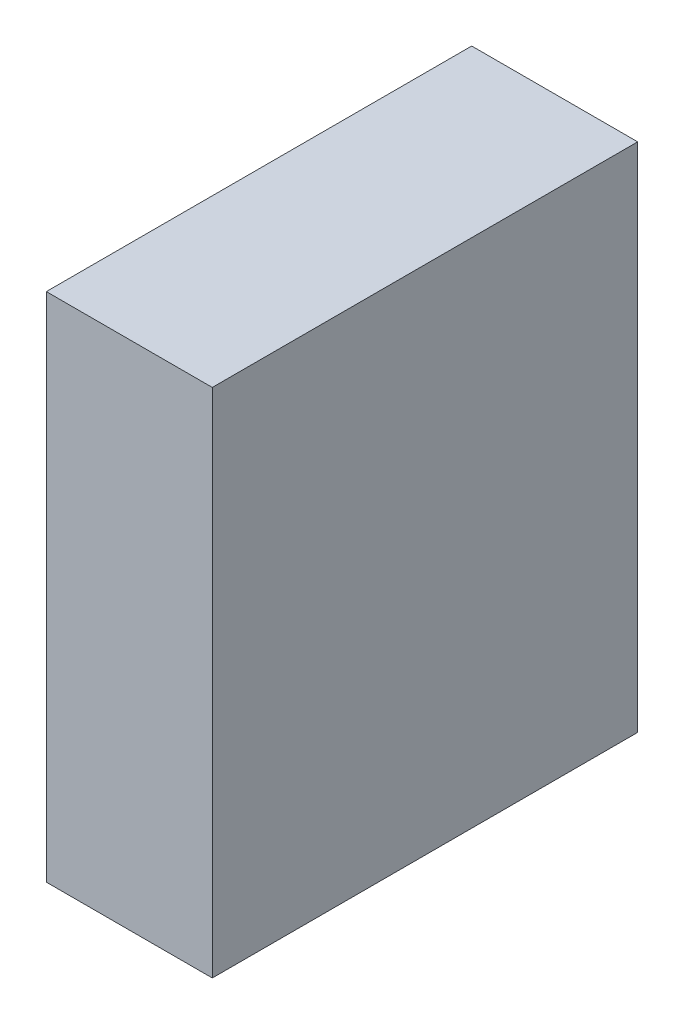
ISO-10303-21;
HEADER;
FILE_DESCRIPTION(('STEP AP214'),'2;1');
FILE_NAME('part.step','',(''),(''),'','','');
FILE_SCHEMA(('AUTOMOTIVE_DESIGN { 1 0 10303 214 1 1 1 1 }'));
ENDSEC;
DATA;
#1=APPLICATION_CONTEXT('core data for automotive mechanical design processes');
#2=APPLICATION_PROTOCOL_DEFINITION('international standard','automotive_design',2000,#1);
#3=PRODUCT_CONTEXT('',#1,'mechanical');
#4=PRODUCT('Part','Part','',(#3));
#5=PRODUCT_RELATED_PRODUCT_CATEGORY('part','',(#4));
#6=PRODUCT_DEFINITION_FORMATION('','',#4);
#7=PRODUCT_DEFINITION_CONTEXT('part definition',#1,'design');
#8=PRODUCT_DEFINITION('design','',#6,#7);
#9=PRODUCT_DEFINITION_SHAPE('','',#8);
#10=(LENGTH_UNIT() NAMED_UNIT(*) SI_UNIT(.MILLI.,.METRE.));
#11=(NAMED_UNIT(*) PLANE_ANGLE_UNIT() SI_UNIT($,.RADIAN.));
#12=(NAMED_UNIT(*) SI_UNIT($,.STERADIAN.) SOLID_ANGLE_UNIT());
#13=UNCERTAINTY_MEASURE_WITH_UNIT(LENGTH_MEASURE(1.E-05),#10,'distance_accuracy_value','');
#14=(GEOMETRIC_REPRESENTATION_CONTEXT(3) GLOBAL_UNCERTAINTY_ASSIGNED_CONTEXT((#13)) GLOBAL_UNIT_ASSIGNED_CONTEXT((#10,
#11,#12)) REPRESENTATION_CONTEXT('',''));
#15=CARTESIAN_POINT('',(0.,0.,0.));
#16=DIRECTION('',(0.,0.,1.));
#17=DIRECTION('',(1.,0.,0.));
#18=AXIS2_PLACEMENT_3D('',#15,#16,#17);
#19=CARTESIAN_POINT('',(0.,0.,33.06));
#20=DIRECTION('',(1.,0.,0.));
#21=DIRECTION('',(0.,1.,0.));
#22=AXIS2_PLACEMENT_3D('',#19,#20,#21);
#23=PLANE('',#22);
#24=DIRECTION('',(0.,-1.,0.));
#25=VECTOR('',#24,1.);
#26=CARTESIAN_POINT('',(0.,0.,0.));
#27=LINE('',#26,#25);
#28=CARTESIAN_POINT('',(0.,0.,0.));
#29=VERTEX_POINT('',#28);
#30=CARTESIAN_POINT('',(0.,-39.75,0.));
#31=VERTEX_POINT('',#30);
#32=EDGE_CURVE('E96',#29,#31,#27,.T.);
#33=ORIENTED_EDGE('',*,*,#32,.T.);
#34=DIRECTION('',(0.,0.,-1.));
#35=VECTOR('',#34,1.);
#36=CARTESIAN_POINT('',(0.,-39.75,33.06));
#37=LINE('',#36,#35);
#38=CARTESIAN_POINT('',(0.,-39.75,33.06));
#39=VERTEX_POINT('',#38);
#40=EDGE_CURVE('E11',#39,#31,#37,.T.);
#41=ORIENTED_EDGE('',*,*,#40,.F.);
#42=DIRECTION('',(0.,-1.,0.));
#43=VECTOR('',#42,1.);
#44=CARTESIAN_POINT('',(0.,0.,33.06));
#45=LINE('',#44,#43);
#46=CARTESIAN_POINT('',(0.,0.,33.06));
#47=VERTEX_POINT('',#46);
#48=EDGE_CURVE('E84',#47,#39,#45,.T.);
#49=ORIENTED_EDGE('',*,*,#48,.F.);
#50=DIRECTION('',(0.,0.,-1.));
#51=VECTOR('',#50,1.);
#52=CARTESIAN_POINT('',(0.,0.,33.06));
#53=LINE('',#52,#51);
#54=EDGE_CURVE('E92',#47,#29,#53,.T.);
#55=ORIENTED_EDGE('',*,*,#54,.T.);
#56=EDGE_LOOP('',(#33,#41,#49,#55));
#57=FACE_BOUND('',#56,.T.);
#58=ADVANCED_FACE('F33',(#57),#23,.F.);
#59=CARTESIAN_POINT('',(0.,-39.75,33.06));
#60=DIRECTION('',(0.,1.,0.));
#61=DIRECTION('',(0.,0.,1.));
#62=AXIS2_PLACEMENT_3D('',#59,#60,#61);
#63=PLANE('',#62);
#64=DIRECTION('',(1.,0.,0.));
#65=VECTOR('',#64,1.);
#66=CARTESIAN_POINT('',(0.,-39.75,0.));
#67=LINE('',#66,#65);
#68=CARTESIAN_POINT('',(12.9,-39.75,0.));
#69=VERTEX_POINT('',#68);
#70=EDGE_CURVE('E88',#31,#69,#67,.T.);
#71=ORIENTED_EDGE('',*,*,#70,.T.);
#72=DIRECTION('',(0.,0.,-1.));
#73=VECTOR('',#72,1.);
#74=CARTESIAN_POINT('',(12.9,-39.75,33.06));
#75=LINE('',#74,#73);
#76=CARTESIAN_POINT('',(12.9,-39.75,33.06));
#77=VERTEX_POINT('',#76);
#78=EDGE_CURVE('E41',#77,#69,#75,.T.);
#79=ORIENTED_EDGE('',*,*,#78,.F.);
#80=DIRECTION('',(1.,0.,0.));
#81=VECTOR('',#80,1.);
#82=CARTESIAN_POINT('',(0.,-39.75,33.06));
#83=LINE('',#82,#81);
#84=EDGE_CURVE('E79',#39,#77,#83,.T.);
#85=ORIENTED_EDGE('',*,*,#84,.F.);
#86=ORIENTED_EDGE('',*,*,#40,.T.);
#87=EDGE_LOOP('',(#71,#79,#85,#86));
#88=FACE_BOUND('',#87,.T.);
#89=ADVANCED_FACE('F87',(#88),#63,.F.);
#90=CARTESIAN_POINT('',(12.9,0.,33.06));
#91=DIRECTION('',(-1.,0.,0.));
#92=DIRECTION('',(0.,-1.,0.));
#93=AXIS2_PLACEMENT_3D('',#90,#91,#92);
#94=PLANE('',#93);
#95=DIRECTION('',(0.,1.,0.));
#96=VECTOR('',#95,1.);
#97=CARTESIAN_POINT('',(12.9,0.,0.));
#98=LINE('',#97,#96);
#99=CARTESIAN_POINT('',(12.9,0.,0.));
#100=VERTEX_POINT('',#99);
#101=EDGE_CURVE('E66',#69,#100,#98,.T.);
#102=ORIENTED_EDGE('',*,*,#101,.T.);
#103=DIRECTION('',(0.,0.,-1.));
#104=VECTOR('',#103,1.);
#105=CARTESIAN_POINT('',(12.9,0.,33.06));
#106=LINE('',#105,#104);
#107=CARTESIAN_POINT('',(12.9,0.,33.06));
#108=VERTEX_POINT('',#107);
#109=EDGE_CURVE('E89',#108,#100,#106,.T.);
#110=ORIENTED_EDGE('',*,*,#109,.F.);
#111=DIRECTION('',(0.,1.,0.));
#112=VECTOR('',#111,1.);
#113=CARTESIAN_POINT('',(12.9,0.,33.06));
#114=LINE('',#113,#112);
#115=EDGE_CURVE('E82',#77,#108,#114,.T.);
#116=ORIENTED_EDGE('',*,*,#115,.F.);
#117=ORIENTED_EDGE('',*,*,#78,.T.);
#118=EDGE_LOOP('',(#102,#110,#116,#117));
#119=FACE_BOUND('',#118,.T.);
#120=ADVANCED_FACE('F90',(#119),#94,.F.);
#121=CARTESIAN_POINT('',(0.,0.,33.06));
#122=DIRECTION('',(0.,-1.,0.));
#123=DIRECTION('',(0.,0.,-1.));
#124=AXIS2_PLACEMENT_3D('',#121,#122,#123);
#125=PLANE('',#124);
#126=DIRECTION('',(-1.,0.,0.));
#127=VECTOR('',#126,1.);
#128=CARTESIAN_POINT('',(0.,0.,0.));
#129=LINE('',#128,#127);
#130=EDGE_CURVE('E72',#100,#29,#129,.T.);
#131=ORIENTED_EDGE('',*,*,#130,.T.);
#132=ORIENTED_EDGE('',*,*,#54,.F.);
#133=DIRECTION('',(-1.,0.,0.));
#134=VECTOR('',#133,1.);
#135=CARTESIAN_POINT('',(0.,0.,33.06));
#136=LINE('',#135,#134);
#137=EDGE_CURVE('E49',#108,#47,#136,.T.);
#138=ORIENTED_EDGE('',*,*,#137,.F.);
#139=ORIENTED_EDGE('',*,*,#109,.T.);
#140=EDGE_LOOP('',(#131,#132,#138,#139));
#141=FACE_BOUND('',#140,.T.);
#142=ADVANCED_FACE('F103',(#141),#125,.F.);
#143=CARTESIAN_POINT('',(0.,0.,33.06));
#144=DIRECTION('',(0.,0.,1.));
#145=DIRECTION('',(1.,0.,0.));
#146=AXIS2_PLACEMENT_3D('',#143,#144,#145);
#147=PLANE('',#146);
#148=ORIENTED_EDGE('',*,*,#48,.T.);
#149=ORIENTED_EDGE('',*,*,#84,.T.);
#150=ORIENTED_EDGE('',*,*,#115,.T.);
#151=ORIENTED_EDGE('',*,*,#137,.T.);
#152=EDGE_LOOP('',(#148,#149,#150,#151));
#153=FACE_BOUND('',#152,.T.);
#154=ADVANCED_FACE('F80',(#153),#147,.T.);
#155=CARTESIAN_POINT('',(0.,0.,0.));
#156=DIRECTION('',(0.,0.,1.));
#157=DIRECTION('',(1.,0.,0.));
#158=AXIS2_PLACEMENT_3D('',#155,#156,#157);
#159=PLANE('',#158);
#160=ORIENTED_EDGE('',*,*,#32,.F.);
#161=ORIENTED_EDGE('',*,*,#130,.F.);
#162=ORIENTED_EDGE('',*,*,#101,.F.);
#163=ORIENTED_EDGE('',*,*,#70,.F.);
#164=EDGE_LOOP('',(#160,#161,#162,#163));
#165=FACE_BOUND('',#164,.T.);
#166=ADVANCED_FACE('F106',(#165),#159,.F.);
#167=CLOSED_SHELL('',(#58,#89,#120,#142,#154,#166));
#168=MANIFOLD_SOLID_BREP('B2',#167);
#169=ADVANCED_BREP_SHAPE_REPRESENTATION('',(#18,#168),#14);
#170=SHAPE_DEFINITION_REPRESENTATION(#9,#169);
ENDSEC;
END-ISO-10303-21;
